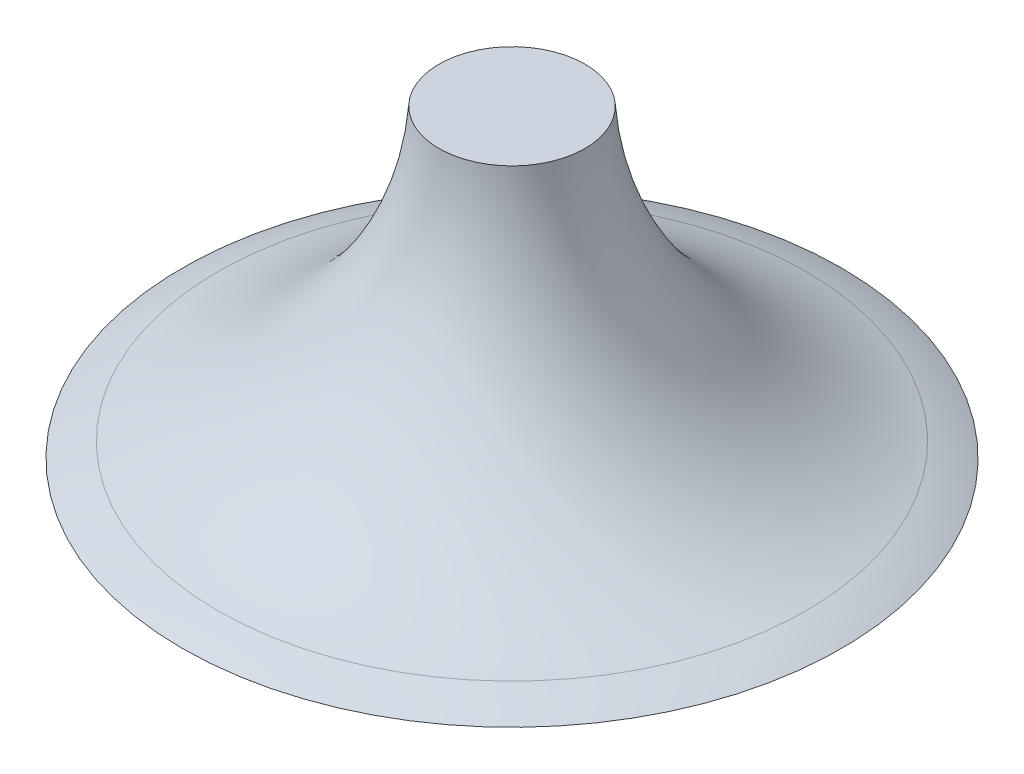
ISO-10303-21;
HEADER;
FILE_DESCRIPTION(('STEP AP214'),'2;1');
FILE_NAME('part.step','',(''),(''),'','','');
FILE_SCHEMA(('AUTOMOTIVE_DESIGN { 1 0 10303 214 1 1 1 1 }'));
ENDSEC;
DATA;
#1=APPLICATION_CONTEXT('core data for automotive mechanical design processes');
#2=APPLICATION_PROTOCOL_DEFINITION('international standard','automotive_design',2000,#1);
#3=PRODUCT_CONTEXT('',#1,'mechanical');
#4=PRODUCT('Part','Part','',(#3));
#5=PRODUCT_RELATED_PRODUCT_CATEGORY('part','',(#4));
#6=PRODUCT_DEFINITION_FORMATION('','',#4);
#7=PRODUCT_DEFINITION_CONTEXT('part definition',#1,'design');
#8=PRODUCT_DEFINITION('design','',#6,#7);
#9=PRODUCT_DEFINITION_SHAPE('','',#8);
#10=(LENGTH_UNIT() NAMED_UNIT(*) SI_UNIT(.MILLI.,.METRE.));
#11=(NAMED_UNIT(*) PLANE_ANGLE_UNIT() SI_UNIT($,.RADIAN.));
#12=(NAMED_UNIT(*) SI_UNIT($,.STERADIAN.) SOLID_ANGLE_UNIT());
#13=UNCERTAINTY_MEASURE_WITH_UNIT(LENGTH_MEASURE(1.E-05),#10,'distance_accuracy_value','');
#14=(GEOMETRIC_REPRESENTATION_CONTEXT(3) GLOBAL_UNCERTAINTY_ASSIGNED_CONTEXT((#13)) GLOBAL_UNIT_ASSIGNED_CONTEXT((#10,
#11,#12)) REPRESENTATION_CONTEXT('',''));
#15=CARTESIAN_POINT('',(0.,0.,0.));
#16=DIRECTION('',(0.,0.,1.));
#17=DIRECTION('',(1.,0.,0.));
#18=AXIS2_PLACEMENT_3D('',#15,#16,#17);
#19=CARTESIAN_POINT('',(0.,40.,0.));
#20=DIRECTION('',(0.,1.,0.));
#21=DIRECTION('',(0.,0.,1.));
#22=AXIS2_PLACEMENT_3D('',#19,#20,#21);
#23=PLANE('',#22);
#24=CARTESIAN_POINT('',(0.,40.,0.));
#25=DIRECTION('',(0.,-1.,0.));
#26=DIRECTION('',(0.,0.,-1.));
#27=AXIS2_PLACEMENT_3D('',#24,#25,#26);
#28=CIRCLE('',#27,5.54070105234821);
#29=CARTESIAN_POINT('',(0.,40.,-5.54070105234821));
#30=VERTEX_POINT('',#29);
#31=EDGE_CURVE('E82',#30,#30,#28,.T.);
#32=ORIENTED_EDGE('',*,*,#31,.F.);
#33=EDGE_LOOP('',(#32));
#34=FACE_BOUND('',#33,.T.);
#35=ADVANCED_FACE('F36',(#34),#23,.T.);
#36=CARTESIAN_POINT('',(0.,16.8820717512354,-25.));
#37=DIRECTION('',(0.,-1.,0.));
#38=DIRECTION('',(0.,0.,-1.));
#39=AXIS2_PLACEMENT_3D('',#36,#37,#38);
#40=PLANE('',#39);
#41=CARTESIAN_POINT('',(0.,16.8820717512354,0.));
#42=DIRECTION('',(0.,-1.,0.));
#43=DIRECTION('',(0.,0.,-1.));
#44=AXIS2_PLACEMENT_3D('',#41,#42,#43);
#45=CIRCLE('',#44,23.7989958633106);
#46=CARTESIAN_POINT('',(0.,16.8820717512354,-23.7989958633106));
#47=VERTEX_POINT('',#46);
#48=EDGE_CURVE('E43',#47,#47,#45,.F.);
#49=ORIENTED_EDGE('',*,*,#48,.T.);
#50=EDGE_LOOP('',(#49));
#51=FACE_BOUND('',#50,.T.);
#52=CARTESIAN_POINT('',(0.,16.8820717512354,0.));
#53=DIRECTION('',(0.,-1.,0.));
#54=DIRECTION('',(0.,0.,-1.));
#55=AXIS2_PLACEMENT_3D('',#52,#53,#54);
#56=CIRCLE('',#55,25.);
#57=CARTESIAN_POINT('',(0.,16.8820717512354,-25.));
#58=VERTEX_POINT('',#57);
#59=EDGE_CURVE('E80',#58,#58,#56,.T.);
#60=ORIENTED_EDGE('',*,*,#59,.T.);
#61=EDGE_LOOP('',(#60));
#62=FACE_BOUND('',#61,.T.);
#63=ADVANCED_FACE('F49',(#51,#62),#40,.T.);
#64=CARTESIAN_POINT('',(0.,0.,0.));
#65=DIRECTION('',(0.,1.,0.));
#66=DIRECTION('',(0.,0.,1.));
#67=AXIS2_PLACEMENT_3D('',#64,#65,#66);
#68=CONICAL_SURFACE('',#67,0.,0.43633231299858);
#69=CARTESIAN_POINT('',(0.,2.44752829475284,0.));
#70=DIRECTION('',(0.,1.,0.));
#71=DIRECTION('',(0.,0.,1.));
#72=AXIS2_PLACEMENT_3D('',#69,#70,#71);
#73=CIRCLE('',#72,1.14130118739429);
#74=CARTESIAN_POINT('',(0.,2.44752829475284,1.14130118739429));
#75=VERTEX_POINT('',#74);
#76=EDGE_CURVE('E85',#75,#75,#73,.F.);
#77=ORIENTED_EDGE('',*,*,#76,.T.);
#78=EDGE_LOOP('',(#77));
#79=FACE_BOUND('',#78,.T.);
#80=CARTESIAN_POINT('',(0.,0.,0.));
#81=VERTEX_POINT('',#80);
#82=VERTEX_LOOP('',#81);
#83=FACE_BOUND('',#82,.T.);
#84=ADVANCED_FACE('F46',(#79,#83),#68,.T.);
#85=CARTESIAN_POINT('',(0.,-8.11792824876459,0.));
#86=DIRECTION('',(0.,-1.,0.));
#87=DIRECTION('',(0.,0.,-1.));
#88=AXIS2_PLACEMENT_3D('',#85,#86,#87);
#89=DEGENERATE_TOROIDAL_SURFACE('',#88,23.7989958633106,25.,.T.);
#90=ORIENTED_EDGE('',*,*,#48,.F.);
#91=EDGE_LOOP('',(#90));
#92=FACE_BOUND('',#91,.T.);
#93=ORIENTED_EDGE('',*,*,#76,.F.);
#94=EDGE_LOOP('',(#93));
#95=FACE_BOUND('',#94,.T.);
#96=ADVANCED_FACE('F48',(#92,#95),#89,.F.);
#97=CARTESIAN_POINT('',(0.,-5.61792824876459,0.));
#98=DIRECTION('',(0.,-1.,0.));
#99=DIRECTION('',(0.,0.,-1.));
#100=AXIS2_PLACEMENT_3D('',#97,#98,#99);
#101=DEGENERATE_TOROIDAL_SURFACE('',#100,14.1027526411483,25.,.T.);
#102=CARTESIAN_POINT('',(0.,18.0015590658418,0.));
#103=DIRECTION('',(0.,-1.,0.));
#104=DIRECTION('',(0.,0.,-1.));
#105=AXIS2_PLACEMENT_3D('',#102,#103,#104);
#106=CIRCLE('',#105,22.2954212537036);
#107=CARTESIAN_POINT('',(0.,18.0015590658418,-22.2954212537036));
#108=VERTEX_POINT('',#107);
#109=EDGE_CURVE('E11',#108,#108,#106,.T.);
#110=ORIENTED_EDGE('',*,*,#109,.T.);
#111=EDGE_LOOP('',(#110));
#112=FACE_BOUND('',#111,.T.);
#113=ORIENTED_EDGE('',*,*,#59,.F.);
#114=EDGE_LOOP('',(#113));
#115=FACE_BOUND('',#114,.T.);
#116=ADVANCED_FACE('F57',(#112,#115),#101,.T.);
#117=CARTESIAN_POINT('',(0.,41.6210463804482,0.));
#118=DIRECTION('',(0.,1.,0.));
#119=DIRECTION('',(0.,0.,1.));
#120=AXIS2_PLACEMENT_3D('',#117,#118,#119);
#121=TOROIDAL_SURFACE('',#120,30.4880898662589,25.);
#122=ORIENTED_EDGE('',*,*,#31,.T.);
#123=EDGE_LOOP('',(#122));
#124=FACE_BOUND('',#123,.T.);
#125=ORIENTED_EDGE('',*,*,#109,.F.);
#126=EDGE_LOOP('',(#125));
#127=FACE_BOUND('',#126,.T.);
#128=ADVANCED_FACE('F38',(#124,#127),#121,.F.);
#129=CLOSED_SHELL('',(#35,#63,#84,#96,#116,#128));
#130=MANIFOLD_SOLID_BREP('B2',#129);
#131=ADVANCED_BREP_SHAPE_REPRESENTATION('',(#18,#130),#14);
#132=SHAPE_DEFINITION_REPRESENTATION(#9,#131);
ENDSEC;
END-ISO-10303-21;
